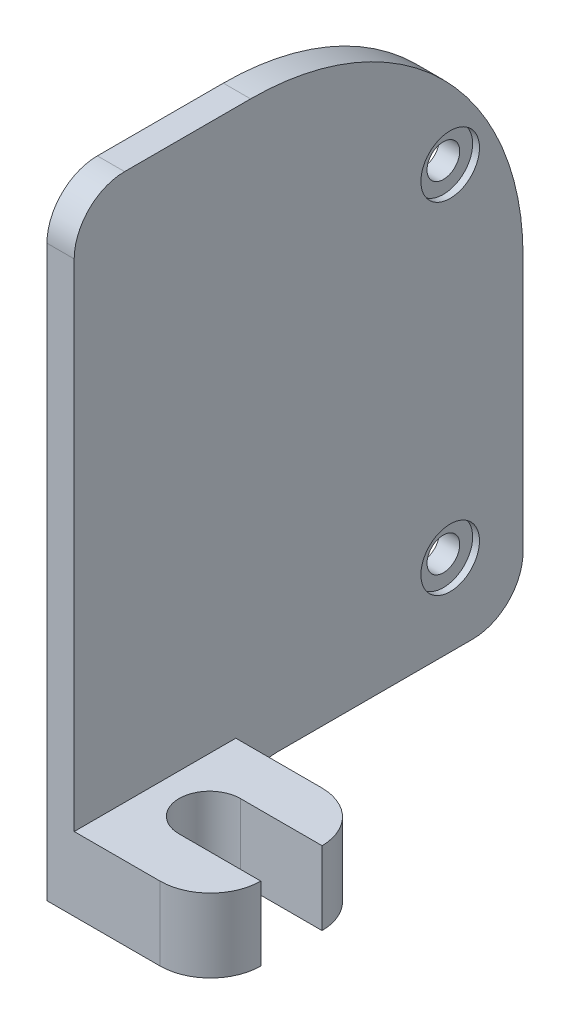
ISO-10303-21;
HEADER;
FILE_DESCRIPTION(('STEP AP214'),'2;1');
FILE_NAME('part.step','',(''),(''),'','','');
FILE_SCHEMA(('AUTOMOTIVE_DESIGN { 1 0 10303 214 1 1 1 1 }'));
ENDSEC;
DATA;
#1=APPLICATION_CONTEXT('core data for automotive mechanical design processes');
#2=APPLICATION_PROTOCOL_DEFINITION('international standard','automotive_design',2000,#1);
#3=PRODUCT_CONTEXT('',#1,'mechanical');
#4=PRODUCT('Part','Part','',(#3));
#5=PRODUCT_RELATED_PRODUCT_CATEGORY('part','',(#4));
#6=PRODUCT_DEFINITION_FORMATION('','',#4);
#7=PRODUCT_DEFINITION_CONTEXT('part definition',#1,'design');
#8=PRODUCT_DEFINITION('design','',#6,#7);
#9=PRODUCT_DEFINITION_SHAPE('','',#8);
#10=(LENGTH_UNIT() NAMED_UNIT(*) SI_UNIT(.MILLI.,.METRE.));
#11=(NAMED_UNIT(*) PLANE_ANGLE_UNIT() SI_UNIT($,.RADIAN.));
#12=(NAMED_UNIT(*) SI_UNIT($,.STERADIAN.) SOLID_ANGLE_UNIT());
#13=UNCERTAINTY_MEASURE_WITH_UNIT(LENGTH_MEASURE(1.E-05),#10,'distance_accuracy_value','');
#14=(GEOMETRIC_REPRESENTATION_CONTEXT(3) GLOBAL_UNCERTAINTY_ASSIGNED_CONTEXT((#13)) GLOBAL_UNIT_ASSIGNED_CONTEXT((#10,
#11,#12)) REPRESENTATION_CONTEXT('',''));
#15=CARTESIAN_POINT('',(0.,0.,0.));
#16=DIRECTION('',(0.,0.,1.));
#17=DIRECTION('',(1.,0.,0.));
#18=AXIS2_PLACEMENT_3D('',#15,#16,#17);
#19=CARTESIAN_POINT('',(6.,-16.6632659547419,0.));
#20=DIRECTION('',(0.,1.,0.));
#21=DIRECTION('',(0.,0.,1.));
#22=AXIS2_PLACEMENT_3D('',#19,#20,#21);
#23=CYLINDRICAL_SURFACE('',#22,2.25);
#24=DIRECTION('',(0.,1.,0.));
#25=VECTOR('',#24,1.);
#26=CARTESIAN_POINT('',(6.,-26.6632659547419,-2.25));
#27=LINE('',#26,#25);
#28=CARTESIAN_POINT('',(6.,-26.6632659547419,-2.25));
#29=VERTEX_POINT('',#28);
#30=CARTESIAN_POINT('',(6.,-21.2632659547419,-2.25));
#31=VERTEX_POINT('',#30);
#32=EDGE_CURVE('E171',#29,#31,#27,.T.);
#33=ORIENTED_EDGE('',*,*,#32,.T.);
#34=CARTESIAN_POINT('',(6.,-21.2632659547419,0.));
#35=DIRECTION('',(0.,1.,0.));
#36=DIRECTION('',(0.,0.,1.));
#37=AXIS2_PLACEMENT_3D('',#34,#35,#36);
#38=CIRCLE('',#37,2.25);
#39=CARTESIAN_POINT('',(6.,-21.2632659547419,2.25));
#40=VERTEX_POINT('',#39);
#41=EDGE_CURVE('E190',#31,#40,#38,.T.);
#42=ORIENTED_EDGE('',*,*,#41,.T.);
#43=DIRECTION('',(0.,1.,0.));
#44=VECTOR('',#43,1.);
#45=CARTESIAN_POINT('',(6.,-26.6632659547419,2.25));
#46=LINE('',#45,#44);
#47=CARTESIAN_POINT('',(6.,-26.6632659547419,2.25));
#48=VERTEX_POINT('',#47);
#49=EDGE_CURVE('E300',#48,#40,#46,.T.);
#50=ORIENTED_EDGE('',*,*,#49,.F.);
#51=CARTESIAN_POINT('',(6.,-26.6632659547419,0.));
#52=DIRECTION('',(0.,1.,0.));
#53=DIRECTION('',(0.,0.,1.));
#54=AXIS2_PLACEMENT_3D('',#51,#52,#53);
#55=CIRCLE('',#54,2.25);
#56=EDGE_CURVE('E194',#29,#48,#55,.T.);
#57=ORIENTED_EDGE('',*,*,#56,.F.);
#58=EDGE_LOOP('',(#33,#42,#50,#57));
#59=FACE_BOUND('',#58,.T.);
#60=ADVANCED_FACE('F50',(#59),#23,.F.);
#61=CARTESIAN_POINT('',(2.,0.,0.));
#62=DIRECTION('',(1.,0.,0.));
#63=DIRECTION('',(0.,0.,-1.));
#64=AXIS2_PLACEMENT_3D('',#61,#62,#63);
#65=PLANE('',#64);
#66=DIRECTION('',(0.,0.,1.));
#67=VECTOR('',#66,1.);
#68=CARTESIAN_POINT('',(2.,-23.6632659547419,-27.));
#69=LINE('',#68,#67);
#70=CARTESIAN_POINT('',(2.,-23.6632659547419,-23.3));
#71=VERTEX_POINT('',#70);
#72=CARTESIAN_POINT('',(2.,-23.6632659547419,-8.915574844975));
#73=VERTEX_POINT('',#72);
#74=EDGE_CURVE('E295',#71,#73,#69,.T.);
#75=ORIENTED_EDGE('',*,*,#74,.F.);
#76=CARTESIAN_POINT('',(2.,-19.9632659547419,-23.3));
#77=DIRECTION('',(1.,0.,0.));
#78=DIRECTION('',(0.,0.,-1.));
#79=AXIS2_PLACEMENT_3D('',#76,#77,#78);
#80=CIRCLE('',#79,3.7);
#81=CARTESIAN_POINT('',(2.,-19.9632659547419,-27.));
#82=VERTEX_POINT('',#81);
#83=EDGE_CURVE('E231',#71,#82,#80,.T.);
#84=ORIENTED_EDGE('',*,*,#83,.T.);
#85=DIRECTION('',(0.,1.,0.));
#86=VECTOR('',#85,1.);
#87=CARTESIAN_POINT('',(2.,-26.6632659547419,-27.));
#88=LINE('',#87,#86);
#89=CARTESIAN_POINT('',(2.,-1.16326595474193,-27.));
#90=VERTEX_POINT('',#89);
#91=EDGE_CURVE('E258',#82,#90,#88,.T.);
#92=ORIENTED_EDGE('',*,*,#91,.T.);
#93=CARTESIAN_POINT('',(2.,-1.16326595474193,-7.00000000000002));
#94=DIRECTION('',(1.,0.,0.));
#95=DIRECTION('',(0.,0.,-1.));
#96=AXIS2_PLACEMENT_3D('',#93,#94,#95);
#97=CIRCLE('',#96,20.);
#98=CARTESIAN_POINT('',(2.,18.8367340452581,-7.00000000000002));
#99=VERTEX_POINT('',#98);
#100=EDGE_CURVE('E249',#90,#99,#97,.T.);
#101=ORIENTED_EDGE('',*,*,#100,.T.);
#102=DIRECTION('',(0.,0.,-1.));
#103=VECTOR('',#102,1.);
#104=CARTESIAN_POINT('',(2.,18.8367340452581,0.));
#105=LINE('',#104,#103);
#106=CARTESIAN_POINT('',(2.,18.8367340452581,2.24807304762172));
#107=VERTEX_POINT('',#106);
#108=EDGE_CURVE('E246',#107,#99,#105,.T.);
#109=ORIENTED_EDGE('',*,*,#108,.F.);
#110=CARTESIAN_POINT('',(2.,15.1367340452581,2.24807304762172));
#111=DIRECTION('',(1.,0.,0.));
#112=DIRECTION('',(0.,0.,-1.));
#113=AXIS2_PLACEMENT_3D('',#110,#111,#112);
#114=CIRCLE('',#113,3.7);
#115=CARTESIAN_POINT('',(2.,15.1367340452581,5.94807304762172));
#116=VERTEX_POINT('',#115);
#117=EDGE_CURVE('E229',#107,#116,#114,.T.);
#118=ORIENTED_EDGE('',*,*,#117,.T.);
#119=DIRECTION('',(0.,1.,0.));
#120=VECTOR('',#119,1.);
#121=CARTESIAN_POINT('',(2.,-24.2583026664145,5.94807304762172));
#122=LINE('',#121,#120);
#123=CARTESIAN_POINT('',(2.,-21.2632659547419,5.94807304762172));
#124=VERTEX_POINT('',#123);
#125=EDGE_CURVE('E181',#124,#116,#122,.T.);
#126=ORIENTED_EDGE('',*,*,#125,.F.);
#127=DIRECTION('',(0.,0.,1.));
#128=VECTOR('',#127,1.);
#129=CARTESIAN_POINT('',(2.,-21.2632659547419,5.94807304762172));
#130=LINE('',#129,#128);
#131=CARTESIAN_POINT('',(2.,-21.2632659547419,-5.91557484497499));
#132=VERTEX_POINT('',#131);
#133=EDGE_CURVE('E163',#132,#124,#130,.T.);
#134=ORIENTED_EDGE('',*,*,#133,.F.);
#135=DIRECTION('',(0.,1.,0.));
#136=VECTOR('',#135,1.);
#137=CARTESIAN_POINT('',(2.,-26.6632659547419,-5.91557484497499));
#138=LINE('',#137,#136);
#139=CARTESIAN_POINT('',(2.,-26.6632659547419,-5.91557484497499));
#140=VERTEX_POINT('',#139);
#141=EDGE_CURVE('E178',#140,#132,#138,.T.);
#142=ORIENTED_EDGE('',*,*,#141,.F.);
#143=CARTESIAN_POINT('',(2.,-26.6632659547419,-8.91557484497499));
#144=DIRECTION('',(1.,0.,0.));
#145=DIRECTION('',(0.,0.,-1.));
#146=AXIS2_PLACEMENT_3D('',#143,#144,#145);
#147=CIRCLE('',#146,3.);
#148=EDGE_CURVE('E210',#140,#73,#147,.F.);
#149=ORIENTED_EDGE('',*,*,#148,.T.);
#150=EDGE_LOOP('',(#75,#84,#92,#101,#109,#118,#126,#134,#142,#149));
#151=FACE_BOUND('',#150,.T.);
#152=CARTESIAN_POINT('',(2.,7.33673404525902,-21.6506350946109));
#153=DIRECTION('',(1.,0.,0.));
#154=DIRECTION('',(0.,0.,-1.));
#155=AXIS2_PLACEMENT_3D('',#152,#153,#154);
#156=CIRCLE('',#155,2.15);
#157=CARTESIAN_POINT('',(2.,7.33673404525902,-23.8006350946109));
#158=VERTEX_POINT('',#157);
#159=EDGE_CURVE('E291',#158,#158,#156,.T.);
#160=ORIENTED_EDGE('',*,*,#159,.F.);
#161=EDGE_LOOP('',(#160));
#162=FACE_BOUND('',#161,.T.);
#163=CARTESIAN_POINT('',(2.,-17.663265954741,-21.6506350946109));
#164=DIRECTION('',(1.,0.,0.));
#165=DIRECTION('',(0.,0.,-1.));
#166=AXIS2_PLACEMENT_3D('',#163,#164,#165);
#167=CIRCLE('',#166,2.15);
#168=CARTESIAN_POINT('',(2.,-17.663265954741,-23.8006350946109));
#169=VERTEX_POINT('',#168);
#170=EDGE_CURVE('E279',#169,#169,#167,.T.);
#171=ORIENTED_EDGE('',*,*,#170,.F.);
#172=EDGE_LOOP('',(#171));
#173=FACE_BOUND('',#172,.T.);
#174=ADVANCED_FACE('F175',(#151,#162,#173),#65,.T.);
#175=CARTESIAN_POINT('',(0.,0.,0.));
#176=DIRECTION('',(1.,0.,0.));
#177=DIRECTION('',(0.,0.,-1.));
#178=AXIS2_PLACEMENT_3D('',#175,#176,#177);
#179=PLANE('',#178);
#180=CARTESIAN_POINT('',(0.,7.33673404525902,-21.6506350946109));
#181=DIRECTION('',(1.,0.,0.));
#182=DIRECTION('',(0.,0.,-1.));
#183=AXIS2_PLACEMENT_3D('',#180,#181,#182);
#184=CIRCLE('',#183,1.2);
#185=CARTESIAN_POINT('',(0.,7.33673404525902,-22.8506350946109));
#186=VERTEX_POINT('',#185);
#187=EDGE_CURVE('E282',#186,#186,#184,.T.);
#188=ORIENTED_EDGE('',*,*,#187,.T.);
#189=EDGE_LOOP('',(#188));
#190=FACE_BOUND('',#189,.T.);
#191=CARTESIAN_POINT('',(0.,-17.663265954741,-21.6506350946109));
#192=DIRECTION('',(1.,0.,0.));
#193=DIRECTION('',(0.,0.,-1.));
#194=AXIS2_PLACEMENT_3D('',#191,#192,#193);
#195=CIRCLE('',#194,1.2);
#196=CARTESIAN_POINT('',(0.,-17.663265954741,-22.8506350946109));
#197=VERTEX_POINT('',#196);
#198=EDGE_CURVE('E247',#197,#197,#195,.T.);
#199=ORIENTED_EDGE('',*,*,#198,.T.);
#200=EDGE_LOOP('',(#199));
#201=FACE_BOUND('',#200,.T.);
#202=DIRECTION('',(0.,-1.,0.));
#203=VECTOR('',#202,1.);
#204=CARTESIAN_POINT('',(0.,-26.6632659547419,-27.));
#205=LINE('',#204,#203);
#206=CARTESIAN_POINT('',(0.,-1.16326595474192,-27.));
#207=VERTEX_POINT('',#206);
#208=CARTESIAN_POINT('',(0.,-19.9632659547419,-27.));
#209=VERTEX_POINT('',#208);
#210=EDGE_CURVE('E200',#207,#209,#205,.T.);
#211=ORIENTED_EDGE('',*,*,#210,.T.);
#212=CARTESIAN_POINT('',(0.,-19.9632659547419,-23.3));
#213=DIRECTION('',(1.,0.,0.));
#214=DIRECTION('',(0.,0.,-1.));
#215=AXIS2_PLACEMENT_3D('',#212,#213,#214);
#216=CIRCLE('',#215,3.7);
#217=CARTESIAN_POINT('',(0.,-23.6632659547419,-23.3));
#218=VERTEX_POINT('',#217);
#219=EDGE_CURVE('E236',#209,#218,#216,.F.);
#220=ORIENTED_EDGE('',*,*,#219,.T.);
#221=DIRECTION('',(0.,0.,1.));
#222=VECTOR('',#221,1.);
#223=CARTESIAN_POINT('',(0.,-23.6632659547419,-27.));
#224=LINE('',#223,#222);
#225=CARTESIAN_POINT('',(0.,-23.6632659547419,-8.915574844975));
#226=VERTEX_POINT('',#225);
#227=EDGE_CURVE('E294',#218,#226,#224,.T.);
#228=ORIENTED_EDGE('',*,*,#227,.T.);
#229=CARTESIAN_POINT('',(0.,-26.6632659547419,-8.91557484497499));
#230=DIRECTION('',(1.,0.,0.));
#231=DIRECTION('',(0.,0.,-1.));
#232=AXIS2_PLACEMENT_3D('',#229,#230,#231);
#233=CIRCLE('',#232,3.);
#234=CARTESIAN_POINT('',(0.,-26.6632659547419,-5.91557484497499));
#235=VERTEX_POINT('',#234);
#236=EDGE_CURVE('E212',#226,#235,#233,.T.);
#237=ORIENTED_EDGE('',*,*,#236,.T.);
#238=DIRECTION('',(0.,0.,-1.));
#239=VECTOR('',#238,1.);
#240=CARTESIAN_POINT('',(0.,-26.6632659547419,19.9480730476217));
#241=LINE('',#240,#239);
#242=CARTESIAN_POINT('',(0.,-26.6632659547419,5.94807304762172));
#243=VERTEX_POINT('',#242);
#244=EDGE_CURVE('E204',#243,#235,#241,.T.);
#245=ORIENTED_EDGE('',*,*,#244,.F.);
#246=DIRECTION('',(0.,1.,0.));
#247=VECTOR('',#246,1.);
#248=CARTESIAN_POINT('',(0.,0.,5.94807304762172));
#249=LINE('',#248,#247);
#250=CARTESIAN_POINT('',(0.,15.1367340452581,5.94807304762172));
#251=VERTEX_POINT('',#250);
#252=EDGE_CURVE('E241',#243,#251,#249,.T.);
#253=ORIENTED_EDGE('',*,*,#252,.T.);
#254=CARTESIAN_POINT('',(0.,15.1367340452581,2.24807304762172));
#255=DIRECTION('',(1.,0.,0.));
#256=DIRECTION('',(0.,0.,-1.));
#257=AXIS2_PLACEMENT_3D('',#254,#255,#256);
#258=CIRCLE('',#257,3.7);
#259=CARTESIAN_POINT('',(0.,18.8367340452581,2.24807304762172));
#260=VERTEX_POINT('',#259);
#261=EDGE_CURVE('E65',#251,#260,#258,.F.);
#262=ORIENTED_EDGE('',*,*,#261,.T.);
#263=DIRECTION('',(0.,0.,-1.));
#264=VECTOR('',#263,1.);
#265=CARTESIAN_POINT('',(0.,18.8367340452581,0.));
#266=LINE('',#265,#264);
#267=CARTESIAN_POINT('',(0.,18.8367340452581,-7.00000000000002));
#268=VERTEX_POINT('',#267);
#269=EDGE_CURVE('E269',#260,#268,#266,.T.);
#270=ORIENTED_EDGE('',*,*,#269,.T.);
#271=CARTESIAN_POINT('',(0.,-1.16326595474193,-7.00000000000002));
#272=DIRECTION('',(1.,0.,0.));
#273=DIRECTION('',(0.,0.,-1.));
#274=AXIS2_PLACEMENT_3D('',#271,#272,#273);
#275=CIRCLE('',#274,20.);
#276=EDGE_CURVE('E267',#207,#268,#275,.T.);
#277=ORIENTED_EDGE('',*,*,#276,.F.);
#278=EDGE_LOOP('',(#211,#220,#228,#237,#245,#253,#262,#270,#277));
#279=FACE_BOUND('',#278,.T.);
#280=ADVANCED_FACE('F245',(#190,#201,#279),#179,.F.);
#281=CARTESIAN_POINT('',(-53.6452245994442,-26.6632659547419,-27.));
#282=DIRECTION('',(0.,0.,-1.));
#283=DIRECTION('',(-1.,0.,0.));
#284=AXIS2_PLACEMENT_3D('',#281,#282,#283);
#285=PLANE('',#284);
#286=ORIENTED_EDGE('',*,*,#91,.F.);
#287=DIRECTION('',(1.,0.,0.));
#288=VECTOR('',#287,1.);
#289=CARTESIAN_POINT('',(0.,-19.9632659547419,-27.));
#290=LINE('',#289,#288);
#291=EDGE_CURVE('E233',#82,#209,#290,.F.);
#292=ORIENTED_EDGE('',*,*,#291,.T.);
#293=ORIENTED_EDGE('',*,*,#210,.F.);
#294=DIRECTION('',(1.,0.,0.));
#295=VECTOR('',#294,1.);
#296=CARTESIAN_POINT('',(0.,-1.16326595474192,-27.));
#297=LINE('',#296,#295);
#298=EDGE_CURVE('E259',#207,#90,#297,.T.);
#299=ORIENTED_EDGE('',*,*,#298,.T.);
#300=EDGE_LOOP('',(#286,#292,#293,#299));
#301=FACE_BOUND('',#300,.T.);
#302=ADVANCED_FACE('F351',(#301),#285,.T.);
#303=CARTESIAN_POINT('',(2.,-26.6632659547419,19.9480730476217));
#304=DIRECTION('',(0.,1.,0.));
#305=DIRECTION('',(0.,0.,1.));
#306=AXIS2_PLACEMENT_3D('',#303,#304,#305);
#307=PLANE('',#306);
#308=DIRECTION('',(1.,0.,0.));
#309=VECTOR('',#308,1.);
#310=CARTESIAN_POINT('',(12.,-26.6632659547419,-5.91557484497499));
#311=LINE('',#310,#309);
#312=CARTESIAN_POINT('',(8.30016015093876,-26.6632659547419,-5.91557484497499));
#313=VERTEX_POINT('',#312);
#314=EDGE_CURVE('E188',#140,#313,#311,.T.);
#315=ORIENTED_EDGE('',*,*,#314,.T.);
#316=CARTESIAN_POINT('',(8.30016015093876,-26.6632659547419,-2.21557484497499));
#317=DIRECTION('',(0.,1.,0.));
#318=DIRECTION('',(0.,0.,1.));
#319=AXIS2_PLACEMENT_3D('',#316,#317,#318);
#320=CIRCLE('',#319,3.7);
#321=CARTESIAN_POINT('',(12.,-26.6632659547419,-2.25));
#322=VERTEX_POINT('',#321);
#323=EDGE_CURVE('E221',#313,#322,#320,.F.);
#324=ORIENTED_EDGE('',*,*,#323,.T.);
#325=DIRECTION('',(-1.,0.,0.));
#326=VECTOR('',#325,1.);
#327=CARTESIAN_POINT('',(6.,-26.6632659547419,-2.25));
#328=LINE('',#327,#326);
#329=EDGE_CURVE('E303',#322,#29,#328,.T.);
#330=ORIENTED_EDGE('',*,*,#329,.T.);
#331=ORIENTED_EDGE('',*,*,#56,.T.);
#332=DIRECTION('',(1.,0.,0.));
#333=VECTOR('',#332,1.);
#334=CARTESIAN_POINT('',(6.,-26.6632659547419,2.25));
#335=LINE('',#334,#333);
#336=CARTESIAN_POINT('',(12.,-26.6632659547419,2.25));
#337=VERTEX_POINT('',#336);
#338=EDGE_CURVE('E313',#48,#337,#335,.T.);
#339=ORIENTED_EDGE('',*,*,#338,.T.);
#340=CARTESIAN_POINT('',(8.30000050177645,-26.6632659547419,2.24807304762172));
#341=DIRECTION('',(0.,1.,0.));
#342=DIRECTION('',(0.,0.,1.));
#343=AXIS2_PLACEMENT_3D('',#340,#341,#342);
#344=CIRCLE('',#343,3.7);
#345=CARTESIAN_POINT('',(8.30000050177645,-26.6632659547419,5.94807304762172));
#346=VERTEX_POINT('',#345);
#347=EDGE_CURVE('E219',#337,#346,#344,.F.);
#348=ORIENTED_EDGE('',*,*,#347,.T.);
#349=DIRECTION('',(-1.,0.,0.));
#350=VECTOR('',#349,1.);
#351=CARTESIAN_POINT('',(12.,-26.6632659547419,5.94807304762172));
#352=LINE('',#351,#350);
#353=EDGE_CURVE('E199',#346,#243,#352,.T.);
#354=ORIENTED_EDGE('',*,*,#353,.T.);
#355=ORIENTED_EDGE('',*,*,#244,.T.);
#356=EDGE_CURVE('E191',#235,#140,#311,.T.);
#357=ORIENTED_EDGE('',*,*,#356,.T.);
#358=EDGE_LOOP('',(#315,#324,#330,#331,#339,#348,#354,#355,#357));
#359=FACE_BOUND('',#358,.T.);
#360=ADVANCED_FACE('F321',(#359),#307,.F.);
#361=CARTESIAN_POINT('',(8.25,-21.2632659547419,0.));
#362=DIRECTION('',(0.,-1.,0.));
#363=DIRECTION('',(0.,0.,-1.));
#364=AXIS2_PLACEMENT_3D('',#361,#362,#363);
#365=PLANE('',#364);
#366=DIRECTION('',(1.,0.,0.));
#367=VECTOR('',#366,1.);
#368=CARTESIAN_POINT('',(6.,-21.2632659547419,2.25));
#369=LINE('',#368,#367);
#370=CARTESIAN_POINT('',(12.,-21.2632659547419,2.25));
#371=VERTEX_POINT('',#370);
#372=EDGE_CURVE('E183',#40,#371,#369,.T.);
#373=ORIENTED_EDGE('',*,*,#372,.F.);
#374=ORIENTED_EDGE('',*,*,#41,.F.);
#375=DIRECTION('',(-1.,0.,0.));
#376=VECTOR('',#375,1.);
#377=CARTESIAN_POINT('',(6.,-21.2632659547419,-2.25));
#378=LINE('',#377,#376);
#379=CARTESIAN_POINT('',(12.,-21.2632659547419,-2.25));
#380=VERTEX_POINT('',#379);
#381=EDGE_CURVE('E311',#380,#31,#378,.T.);
#382=ORIENTED_EDGE('',*,*,#381,.F.);
#383=CARTESIAN_POINT('',(8.30016015093876,-21.2632659547419,-2.21557484497499));
#384=DIRECTION('',(0.,-1.,0.));
#385=DIRECTION('',(0.,0.,-1.));
#386=AXIS2_PLACEMENT_3D('',#383,#384,#385);
#387=CIRCLE('',#386,3.7);
#388=CARTESIAN_POINT('',(8.30016015093876,-21.2632659547419,-5.91557484497499));
#389=VERTEX_POINT('',#388);
#390=EDGE_CURVE('E166',#380,#389,#387,.F.);
#391=ORIENTED_EDGE('',*,*,#390,.T.);
#392=DIRECTION('',(-1.,0.,0.));
#393=VECTOR('',#392,1.);
#394=CARTESIAN_POINT('',(12.,-21.2632659547419,-5.91557484497499));
#395=LINE('',#394,#393);
#396=EDGE_CURVE('E158',#389,#132,#395,.T.);
#397=ORIENTED_EDGE('',*,*,#396,.T.);
#398=ORIENTED_EDGE('',*,*,#133,.T.);
#399=DIRECTION('',(1.,0.,0.));
#400=VECTOR('',#399,1.);
#401=CARTESIAN_POINT('',(12.,-21.2632659547419,5.94807304762172));
#402=LINE('',#401,#400);
#403=CARTESIAN_POINT('',(8.30000050177645,-21.2632659547419,5.94807304762172));
#404=VERTEX_POINT('',#403);
#405=EDGE_CURVE('E170',#124,#404,#402,.T.);
#406=ORIENTED_EDGE('',*,*,#405,.T.);
#407=CARTESIAN_POINT('',(8.30000050177645,-21.2632659547419,2.24807304762172));
#408=DIRECTION('',(0.,-1.,0.));
#409=DIRECTION('',(0.,0.,-1.));
#410=AXIS2_PLACEMENT_3D('',#407,#408,#409);
#411=CIRCLE('',#410,3.7);
#412=EDGE_CURVE('E214',#404,#371,#411,.F.);
#413=ORIENTED_EDGE('',*,*,#412,.T.);
#414=EDGE_LOOP('',(#373,#374,#382,#391,#397,#398,#406,#413));
#415=FACE_BOUND('',#414,.T.);
#416=ADVANCED_FACE('F161',(#415),#365,.F.);
#417=CARTESIAN_POINT('',(12.,-26.6632659547419,-5.91557484497499));
#418=DIRECTION('',(0.,0.,1.));
#419=DIRECTION('',(1.,0.,0.));
#420=AXIS2_PLACEMENT_3D('',#417,#418,#419);
#421=PLANE('',#420);
#422=ORIENTED_EDGE('',*,*,#141,.T.);
#423=ORIENTED_EDGE('',*,*,#396,.F.);
#424=DIRECTION('',(0.,1.,0.));
#425=VECTOR('',#424,1.);
#426=CARTESIAN_POINT('',(8.30016015093876,-26.6632659547419,-5.91557484497499));
#427=LINE('',#426,#425);
#428=EDGE_CURVE('E217',#389,#313,#427,.F.);
#429=ORIENTED_EDGE('',*,*,#428,.T.);
#430=ORIENTED_EDGE('',*,*,#314,.F.);
#431=EDGE_LOOP('',(#422,#423,#429,#430));
#432=FACE_BOUND('',#431,.T.);
#433=ADVANCED_FACE('F186',(#432),#421,.F.);
#434=CARTESIAN_POINT('',(12.,-26.6632659547419,5.94807304762172));
#435=DIRECTION('',(0.,0.,-1.));
#436=DIRECTION('',(-1.,0.,0.));
#437=AXIS2_PLACEMENT_3D('',#434,#435,#436);
#438=PLANE('',#437);
#439=ORIENTED_EDGE('',*,*,#405,.F.);
#440=ORIENTED_EDGE('',*,*,#125,.T.);
#441=DIRECTION('',(-1.,0.,0.));
#442=VECTOR('',#441,1.);
#443=CARTESIAN_POINT('',(12.,15.1367340452581,5.94807304762172));
#444=LINE('',#443,#442);
#445=EDGE_CURVE('E58',#116,#251,#444,.T.);
#446=ORIENTED_EDGE('',*,*,#445,.T.);
#447=ORIENTED_EDGE('',*,*,#252,.F.);
#448=ORIENTED_EDGE('',*,*,#353,.F.);
#449=DIRECTION('',(0.,-1.,0.));
#450=VECTOR('',#449,1.);
#451=CARTESIAN_POINT('',(8.30000050177645,-26.6632659547419,5.94807304762172));
#452=LINE('',#451,#450);
#453=EDGE_CURVE('E223',#346,#404,#452,.F.);
#454=ORIENTED_EDGE('',*,*,#453,.T.);
#455=EDGE_LOOP('',(#439,#440,#446,#447,#448,#454));
#456=FACE_BOUND('',#455,.T.);
#457=ADVANCED_FACE('F239',(#456),#438,.F.);
#458=CARTESIAN_POINT('',(0.,-1.16326595474193,-7.00000000000002));
#459=DIRECTION('',(1.,0.,0.));
#460=DIRECTION('',(0.,0.,-1.));
#461=AXIS2_PLACEMENT_3D('',#458,#459,#460);
#462=CYLINDRICAL_SURFACE('',#461,20.);
#463=ORIENTED_EDGE('',*,*,#100,.F.);
#464=ORIENTED_EDGE('',*,*,#298,.F.);
#465=ORIENTED_EDGE('',*,*,#276,.T.);
#466=DIRECTION('',(1.,0.,0.));
#467=VECTOR('',#466,1.);
#468=CARTESIAN_POINT('',(0.,18.8367340452581,-7.00000000000002));
#469=LINE('',#468,#467);
#470=EDGE_CURVE('E256',#268,#99,#469,.T.);
#471=ORIENTED_EDGE('',*,*,#470,.T.);
#472=EDGE_LOOP('',(#463,#464,#465,#471));
#473=FACE_BOUND('',#472,.T.);
#474=ADVANCED_FACE('F355',(#473),#462,.T.);
#475=CARTESIAN_POINT('',(0.,18.8367340452581,0.));
#476=DIRECTION('',(0.,-1.,0.));
#477=DIRECTION('',(0.,0.,-1.));
#478=AXIS2_PLACEMENT_3D('',#475,#476,#477);
#479=PLANE('',#478);
#480=ORIENTED_EDGE('',*,*,#269,.F.);
#481=DIRECTION('',(-1.,0.,0.));
#482=VECTOR('',#481,1.);
#483=CARTESIAN_POINT('',(0.,18.8367340452581,2.24807304762172));
#484=LINE('',#483,#482);
#485=EDGE_CURVE('E13',#260,#107,#484,.F.);
#486=ORIENTED_EDGE('',*,*,#485,.T.);
#487=ORIENTED_EDGE('',*,*,#108,.T.);
#488=ORIENTED_EDGE('',*,*,#470,.F.);
#489=EDGE_LOOP('',(#480,#486,#487,#488));
#490=FACE_BOUND('',#489,.T.);
#491=ADVANCED_FACE('F357',(#490),#479,.F.);
#492=CARTESIAN_POINT('',(2.,-17.663265954741,-21.6506350946109));
#493=DIRECTION('',(1.,0.,0.));
#494=DIRECTION('',(0.,0.,-1.));
#495=AXIS2_PLACEMENT_3D('',#492,#493,#494);
#496=CYLINDRICAL_SURFACE('',#495,1.2);
#497=ORIENTED_EDGE('',*,*,#198,.F.);
#498=EDGE_LOOP('',(#497));
#499=FACE_BOUND('',#498,.T.);
#500=CARTESIAN_POINT('',(1.5,-17.663265954741,-21.6506350946109));
#501=DIRECTION('',(1.,0.,0.));
#502=DIRECTION('',(0.,0.,-1.));
#503=AXIS2_PLACEMENT_3D('',#500,#501,#502);
#504=CIRCLE('',#503,1.2);
#505=CARTESIAN_POINT('',(1.5,-17.663265954741,-22.8506350946109));
#506=VERTEX_POINT('',#505);
#507=EDGE_CURVE('E252',#506,#506,#504,.T.);
#508=ORIENTED_EDGE('',*,*,#507,.T.);
#509=EDGE_LOOP('',(#508));
#510=FACE_BOUND('',#509,.T.);
#511=ADVANCED_FACE('F449',(#499,#510),#496,.F.);
#512=CARTESIAN_POINT('',(1.5,-16.463265954741,-21.6506350946109));
#513=DIRECTION('',(-1.,0.,0.));
#514=DIRECTION('',(0.,0.,1.));
#515=AXIS2_PLACEMENT_3D('',#512,#513,#514);
#516=PLANE('',#515);
#517=ORIENTED_EDGE('',*,*,#507,.F.);
#518=EDGE_LOOP('',(#517));
#519=FACE_BOUND('',#518,.T.);
#520=CARTESIAN_POINT('',(1.5,-17.663265954741,-21.6506350946109));
#521=DIRECTION('',(1.,0.,0.));
#522=DIRECTION('',(0.,0.,-1.));
#523=AXIS2_PLACEMENT_3D('',#520,#521,#522);
#524=CIRCLE('',#523,2.15);
#525=CARTESIAN_POINT('',(1.5,-17.663265954741,-23.8006350946109));
#526=VERTEX_POINT('',#525);
#527=EDGE_CURVE('E276',#526,#526,#524,.T.);
#528=ORIENTED_EDGE('',*,*,#527,.T.);
#529=EDGE_LOOP('',(#528));
#530=FACE_BOUND('',#529,.T.);
#531=ADVANCED_FACE('F456',(#519,#530),#516,.F.);
#532=CARTESIAN_POINT('',(2.,-17.663265954741,-21.6506350946109));
#533=DIRECTION('',(1.,0.,0.));
#534=DIRECTION('',(0.,0.,-1.));
#535=AXIS2_PLACEMENT_3D('',#532,#533,#534);
#536=CYLINDRICAL_SURFACE('',#535,2.15);
#537=ORIENTED_EDGE('',*,*,#527,.F.);
#538=EDGE_LOOP('',(#537));
#539=FACE_BOUND('',#538,.T.);
#540=ORIENTED_EDGE('',*,*,#170,.T.);
#541=EDGE_LOOP('',(#540));
#542=FACE_BOUND('',#541,.T.);
#543=ADVANCED_FACE('F464',(#539,#542),#536,.F.);
#544=CARTESIAN_POINT('',(2.,7.33673404525902,-21.6506350946109));
#545=DIRECTION('',(1.,0.,0.));
#546=DIRECTION('',(0.,0.,-1.));
#547=AXIS2_PLACEMENT_3D('',#544,#545,#546);
#548=CYLINDRICAL_SURFACE('',#547,1.2);
#549=ORIENTED_EDGE('',*,*,#187,.F.);
#550=EDGE_LOOP('',(#549));
#551=FACE_BOUND('',#550,.T.);
#552=CARTESIAN_POINT('',(1.5,7.33673404525902,-21.6506350946109));
#553=DIRECTION('',(1.,0.,0.));
#554=DIRECTION('',(0.,0.,-1.));
#555=AXIS2_PLACEMENT_3D('',#552,#553,#554);
#556=CIRCLE('',#555,1.2);
#557=CARTESIAN_POINT('',(1.5,7.33673404525902,-22.8506350946109));
#558=VERTEX_POINT('',#557);
#559=EDGE_CURVE('E285',#558,#558,#556,.T.);
#560=ORIENTED_EDGE('',*,*,#559,.T.);
#561=EDGE_LOOP('',(#560));
#562=FACE_BOUND('',#561,.T.);
#563=ADVANCED_FACE('F472',(#551,#562),#548,.F.);
#564=CARTESIAN_POINT('',(1.5,8.53673404525902,-21.6506350946109));
#565=DIRECTION('',(-1.,0.,0.));
#566=DIRECTION('',(0.,0.,1.));
#567=AXIS2_PLACEMENT_3D('',#564,#565,#566);
#568=PLANE('',#567);
#569=ORIENTED_EDGE('',*,*,#559,.F.);
#570=EDGE_LOOP('',(#569));
#571=FACE_BOUND('',#570,.T.);
#572=CARTESIAN_POINT('',(1.5,7.33673404525902,-21.6506350946109));
#573=DIRECTION('',(1.,0.,0.));
#574=DIRECTION('',(0.,0.,-1.));
#575=AXIS2_PLACEMENT_3D('',#572,#573,#574);
#576=CIRCLE('',#575,2.15);
#577=CARTESIAN_POINT('',(1.5,7.33673404525902,-23.8006350946109));
#578=VERTEX_POINT('',#577);
#579=EDGE_CURVE('E288',#578,#578,#576,.T.);
#580=ORIENTED_EDGE('',*,*,#579,.T.);
#581=EDGE_LOOP('',(#580));
#582=FACE_BOUND('',#581,.T.);
#583=ADVANCED_FACE('F480',(#571,#582),#568,.F.);
#584=CARTESIAN_POINT('',(2.,7.33673404525902,-21.6506350946109));
#585=DIRECTION('',(1.,0.,0.));
#586=DIRECTION('',(0.,0.,-1.));
#587=AXIS2_PLACEMENT_3D('',#584,#585,#586);
#588=CYLINDRICAL_SURFACE('',#587,2.15);
#589=ORIENTED_EDGE('',*,*,#579,.F.);
#590=EDGE_LOOP('',(#589));
#591=FACE_BOUND('',#590,.T.);
#592=ORIENTED_EDGE('',*,*,#159,.T.);
#593=EDGE_LOOP('',(#592));
#594=FACE_BOUND('',#593,.T.);
#595=ADVANCED_FACE('F488',(#591,#594),#588,.F.);
#596=CARTESIAN_POINT('',(0.,-23.6632659547419,-27.));
#597=DIRECTION('',(0.,1.,0.));
#598=DIRECTION('',(0.,0.,1.));
#599=AXIS2_PLACEMENT_3D('',#596,#597,#598);
#600=PLANE('',#599);
#601=ORIENTED_EDGE('',*,*,#227,.F.);
#602=DIRECTION('',(1.,0.,0.));
#603=VECTOR('',#602,1.);
#604=CARTESIAN_POINT('',(2.,-23.6632659547419,-23.3));
#605=LINE('',#604,#603);
#606=EDGE_CURVE('E226',#218,#71,#605,.T.);
#607=ORIENTED_EDGE('',*,*,#606,.T.);
#608=ORIENTED_EDGE('',*,*,#74,.T.);
#609=DIRECTION('',(1.,0.,0.));
#610=VECTOR('',#609,1.);
#611=CARTESIAN_POINT('',(0.,-23.6632659547419,-8.91557484497499));
#612=LINE('',#611,#610);
#613=EDGE_CURVE('E207',#73,#226,#612,.F.);
#614=ORIENTED_EDGE('',*,*,#613,.T.);
#615=EDGE_LOOP('',(#601,#607,#608,#614));
#616=FACE_BOUND('',#615,.T.);
#617=ADVANCED_FACE('F345',(#616),#600,.F.);
#618=CARTESIAN_POINT('',(12.,-26.6632659547419,-8.915574844975));
#619=DIRECTION('',(-1.,0.,0.));
#620=DIRECTION('',(0.,0.,1.));
#621=AXIS2_PLACEMENT_3D('',#618,#619,#620);
#622=CYLINDRICAL_SURFACE('',#621,3.);
#623=ORIENTED_EDGE('',*,*,#236,.F.);
#624=ORIENTED_EDGE('',*,*,#613,.F.);
#625=ORIENTED_EDGE('',*,*,#148,.F.);
#626=ORIENTED_EDGE('',*,*,#356,.F.);
#627=EDGE_LOOP('',(#623,#624,#625,#626));
#628=FACE_BOUND('',#627,.T.);
#629=ADVANCED_FACE('F341',(#628),#622,.F.);
#630=CARTESIAN_POINT('',(6.,-26.6632659547419,2.25));
#631=DIRECTION('',(0.,0.,1.));
#632=DIRECTION('',(1.,0.,0.));
#633=AXIS2_PLACEMENT_3D('',#630,#631,#632);
#634=PLANE('',#633);
#635=ORIENTED_EDGE('',*,*,#372,.T.);
#636=DIRECTION('',(0.,1.,0.));
#637=VECTOR('',#636,1.);
#638=CARTESIAN_POINT('',(12.,-26.6632659547419,2.25));
#639=LINE('',#638,#637);
#640=EDGE_CURVE('E302',#337,#371,#639,.T.);
#641=ORIENTED_EDGE('',*,*,#640,.F.);
#642=ORIENTED_EDGE('',*,*,#338,.F.);
#643=ORIENTED_EDGE('',*,*,#49,.T.);
#644=EDGE_LOOP('',(#635,#641,#642,#643));
#645=FACE_BOUND('',#644,.T.);
#646=ADVANCED_FACE('F329',(#645),#634,.F.);
#647=CARTESIAN_POINT('',(6.,-26.6632659547419,-2.25));
#648=DIRECTION('',(0.,0.,-1.));
#649=DIRECTION('',(-1.,0.,0.));
#650=AXIS2_PLACEMENT_3D('',#647,#648,#649);
#651=PLANE('',#650);
#652=ORIENTED_EDGE('',*,*,#381,.T.);
#653=ORIENTED_EDGE('',*,*,#32,.F.);
#654=ORIENTED_EDGE('',*,*,#329,.F.);
#655=DIRECTION('',(0.,1.,0.));
#656=VECTOR('',#655,1.);
#657=CARTESIAN_POINT('',(12.,-26.6632659547419,-2.25));
#658=LINE('',#657,#656);
#659=EDGE_CURVE('E306',#322,#380,#658,.T.);
#660=ORIENTED_EDGE('',*,*,#659,.T.);
#661=EDGE_LOOP('',(#652,#653,#654,#660));
#662=FACE_BOUND('',#661,.T.);
#663=ADVANCED_FACE('F332',(#662),#651,.F.);
#664=CARTESIAN_POINT('',(8.30016015093876,-16.6632659547419,-2.21557484497499));
#665=DIRECTION('',(0.,1.,0.));
#666=DIRECTION('',(0.,0.,1.));
#667=AXIS2_PLACEMENT_3D('',#664,#665,#666);
#668=CYLINDRICAL_SURFACE('',#667,3.7);
#669=ORIENTED_EDGE('',*,*,#323,.F.);
#670=ORIENTED_EDGE('',*,*,#428,.F.);
#671=ORIENTED_EDGE('',*,*,#390,.F.);
#672=ORIENTED_EDGE('',*,*,#659,.F.);
#673=EDGE_LOOP('',(#669,#670,#671,#672));
#674=FACE_BOUND('',#673,.T.);
#675=ADVANCED_FACE('F337',(#674),#668,.T.);
#676=CARTESIAN_POINT('',(8.30000050177645,-16.6632659547419,2.24807304762172));
#677=DIRECTION('',(0.,-1.,0.));
#678=DIRECTION('',(0.,0.,-1.));
#679=AXIS2_PLACEMENT_3D('',#676,#677,#678);
#680=CYLINDRICAL_SURFACE('',#679,3.7);
#681=ORIENTED_EDGE('',*,*,#347,.F.);
#682=ORIENTED_EDGE('',*,*,#640,.T.);
#683=ORIENTED_EDGE('',*,*,#412,.F.);
#684=ORIENTED_EDGE('',*,*,#453,.F.);
#685=EDGE_LOOP('',(#681,#682,#683,#684));
#686=FACE_BOUND('',#685,.T.);
#687=ADVANCED_FACE('F327',(#686),#680,.T.);
#688=CARTESIAN_POINT('',(0.,-19.9632659547419,-23.3));
#689=DIRECTION('',(-1.,0.,0.));
#690=DIRECTION('',(0.,0.,1.));
#691=AXIS2_PLACEMENT_3D('',#688,#689,#690);
#692=CYLINDRICAL_SURFACE('',#691,3.7);
#693=ORIENTED_EDGE('',*,*,#219,.F.);
#694=ORIENTED_EDGE('',*,*,#291,.F.);
#695=ORIENTED_EDGE('',*,*,#83,.F.);
#696=ORIENTED_EDGE('',*,*,#606,.F.);
#697=EDGE_LOOP('',(#693,#694,#695,#696));
#698=FACE_BOUND('',#697,.T.);
#699=ADVANCED_FACE('F349',(#698),#692,.T.);
#700=CARTESIAN_POINT('',(12.,15.1367340452581,2.24807304762172));
#701=DIRECTION('',(-1.,0.,0.));
#702=DIRECTION('',(0.,0.,1.));
#703=AXIS2_PLACEMENT_3D('',#700,#701,#702);
#704=CYLINDRICAL_SURFACE('',#703,3.7);
#705=ORIENTED_EDGE('',*,*,#117,.F.);
#706=ORIENTED_EDGE('',*,*,#485,.F.);
#707=ORIENTED_EDGE('',*,*,#261,.F.);
#708=ORIENTED_EDGE('',*,*,#445,.F.);
#709=EDGE_LOOP('',(#705,#706,#707,#708));
#710=FACE_BOUND('',#709,.T.);
#711=ADVANCED_FACE('F52',(#710),#704,.T.);
#712=CLOSED_SHELL('',(#60,#174,#280,#302,#360,#416,#433,#457,#474,#491,#511,#531,#543,#563,#583,
#595,#617,#629,#646,#663,#675,#687,#699,#711));
#713=MANIFOLD_SOLID_BREP('B2',#712);
#714=ADVANCED_BREP_SHAPE_REPRESENTATION('',(#18,#713),#14);
#715=SHAPE_DEFINITION_REPRESENTATION(#9,#714);
ENDSEC;
END-ISO-10303-21;
